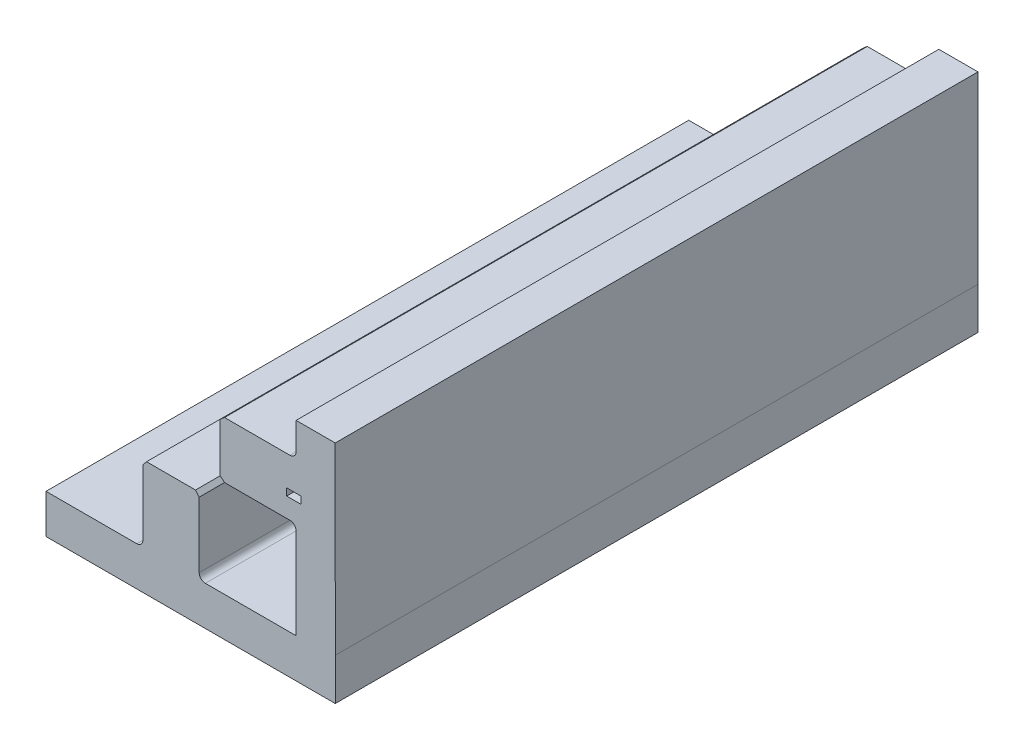
ISO-10303-21;
HEADER;
FILE_DESCRIPTION(('STEP AP214'),'2;1');
FILE_NAME('part.step','',(''),(''),'','','');
FILE_SCHEMA(('AUTOMOTIVE_DESIGN { 1 0 10303 214 1 1 1 1 }'));
ENDSEC;
DATA;
#1=APPLICATION_CONTEXT('core data for automotive mechanical design processes');
#2=APPLICATION_PROTOCOL_DEFINITION('international standard','automotive_design',2000,#1);
#3=PRODUCT_CONTEXT('',#1,'mechanical');
#4=PRODUCT('Part','Part','',(#3));
#5=PRODUCT_RELATED_PRODUCT_CATEGORY('part','',(#4));
#6=PRODUCT_DEFINITION_FORMATION('','',#4);
#7=PRODUCT_DEFINITION_CONTEXT('part definition',#1,'design');
#8=PRODUCT_DEFINITION('design','',#6,#7);
#9=PRODUCT_DEFINITION_SHAPE('','',#8);
#10=(LENGTH_UNIT() NAMED_UNIT(*) SI_UNIT(.MILLI.,.METRE.));
#11=(NAMED_UNIT(*) PLANE_ANGLE_UNIT() SI_UNIT($,.RADIAN.));
#12=(NAMED_UNIT(*) SI_UNIT($,.STERADIAN.) SOLID_ANGLE_UNIT());
#13=UNCERTAINTY_MEASURE_WITH_UNIT(LENGTH_MEASURE(1.E-05),#10,'distance_accuracy_value','');
#14=(GEOMETRIC_REPRESENTATION_CONTEXT(3) GLOBAL_UNCERTAINTY_ASSIGNED_CONTEXT((#13)) GLOBAL_UNIT_ASSIGNED_CONTEXT((#10,
#11,#12)) REPRESENTATION_CONTEXT('',''));
#15=CARTESIAN_POINT('',(0.,0.,0.));
#16=DIRECTION('',(0.,0.,1.));
#17=DIRECTION('',(1.,0.,0.));
#18=AXIS2_PLACEMENT_3D('',#15,#16,#17);
#19=CARTESIAN_POINT('',(17.7288391379452,22.9352063032006,-3749.675));
#20=DIRECTION('',(0.,-1.,0.));
#21=DIRECTION('',(0.,0.,-1.));
#22=AXIS2_PLACEMENT_3D('',#19,#20,#21);
#23=PLANE('',#22);
#24=DIRECTION('',(1.,0.,0.));
#25=VECTOR('',#24,1.);
#26=CARTESIAN_POINT('',(17.7288391379452,22.9352063032006,-3683.));
#27=LINE('',#26,#25);
#28=CARTESIAN_POINT('',(17.7288391379452,22.9352063032006,-3683.));
#29=VERTEX_POINT('',#28);
#30=CARTESIAN_POINT('',(21.7872141992322,22.9352063032006,-3683.));
#31=VERTEX_POINT('',#30);
#32=EDGE_CURVE('E265',#29,#31,#27,.T.);
#33=ORIENTED_EDGE('',*,*,#32,.T.);
#34=DIRECTION('',(0.,0.,1.));
#35=VECTOR('',#34,1.);
#36=CARTESIAN_POINT('',(21.7872141992322,22.9352063032006,-3749.675));
#37=LINE('',#36,#35);
#38=CARTESIAN_POINT('',(21.7872141992322,22.9352063032006,-3749.675));
#39=VERTEX_POINT('',#38);
#40=EDGE_CURVE('E11',#39,#31,#37,.T.);
#41=ORIENTED_EDGE('',*,*,#40,.F.);
#42=DIRECTION('',(1.,0.,0.));
#43=VECTOR('',#42,1.);
#44=CARTESIAN_POINT('',(17.7288391379452,22.9352063032006,-3749.675));
#45=LINE('',#44,#43);
#46=CARTESIAN_POINT('',(17.7288391379452,22.9352063032006,-3749.675));
#47=VERTEX_POINT('',#46);
#48=EDGE_CURVE('E268',#47,#39,#45,.T.);
#49=ORIENTED_EDGE('',*,*,#48,.F.);
#50=DIRECTION('',(0.,0.,1.));
#51=VECTOR('',#50,1.);
#52=CARTESIAN_POINT('',(17.7288391379452,22.9352063032006,-3749.675));
#53=LINE('',#52,#51);
#54=EDGE_CURVE('E320',#47,#29,#53,.T.);
#55=ORIENTED_EDGE('',*,*,#54,.T.);
#56=EDGE_LOOP('',(#33,#41,#49,#55));
#57=FACE_BOUND('',#56,.T.);
#58=ADVANCED_FACE('F33',(#57),#23,.F.);
#59=CARTESIAN_POINT('',(21.7872141992322,22.9352063032006,-3749.675));
#60=DIRECTION('',(-0.999999969550356,-0.000246777810830954,0.));
#61=DIRECTION('',(0.000246777810830954,-0.999999969550356,0.));
#62=AXIS2_PLACEMENT_3D('',#59,#60,#61);
#63=PLANE('',#62);
#64=DIRECTION('',(0.000246777810830954,-0.999999969550356,0.));
#65=VECTOR('',#64,1.);
#66=CARTESIAN_POINT('',(21.7872141992322,22.9352063032006,-3683.));
#67=LINE('',#66,#65);
#68=CARTESIAN_POINT('',(21.791921752024,3.85912878792336,-3683.));
#69=VERTEX_POINT('',#68);
#70=EDGE_CURVE('E323',#31,#69,#67,.T.);
#71=ORIENTED_EDGE('',*,*,#70,.T.);
#72=DIRECTION('',(0.,0.,1.));
#73=VECTOR('',#72,1.);
#74=CARTESIAN_POINT('',(21.791921752024,3.85912878792336,-3749.675));
#75=LINE('',#74,#73);
#76=CARTESIAN_POINT('',(21.791921752024,3.85912878792336,-3749.675));
#77=VERTEX_POINT('',#76);
#78=EDGE_CURVE('E40',#77,#69,#75,.T.);
#79=ORIENTED_EDGE('',*,*,#78,.F.);
#80=DIRECTION('',(0.000246777810830954,-0.999999969550356,0.));
#81=VECTOR('',#80,1.);
#82=CARTESIAN_POINT('',(21.7872141992322,22.9352063032006,-3749.675));
#83=LINE('',#82,#81);
#84=EDGE_CURVE('E271',#39,#77,#83,.T.);
#85=ORIENTED_EDGE('',*,*,#84,.F.);
#86=ORIENTED_EDGE('',*,*,#40,.T.);
#87=EDGE_LOOP('',(#71,#79,#85,#86));
#88=FACE_BOUND('',#87,.T.);
#89=ADVANCED_FACE('F432',(#88),#63,.F.);
#90=CARTESIAN_POINT('',(21.791921752024,-0.47513727151985,-3749.675));
#91=DIRECTION('',(-1.,0.,0.));
#92=DIRECTION('',(0.,0.,1.));
#93=AXIS2_PLACEMENT_3D('',#90,#91,#92);
#94=PLANE('',#93);
#95=DIRECTION('',(0.,-1.,0.));
#96=VECTOR('',#95,1.);
#97=CARTESIAN_POINT('',(21.791921752024,-0.47513727151985,-3683.));
#98=LINE('',#97,#96);
#99=CARTESIAN_POINT('',(21.791921752024,-0.47513727151985,-3683.));
#100=VERTEX_POINT('',#99);
#101=EDGE_CURVE('E326',#69,#100,#98,.T.);
#102=ORIENTED_EDGE('',*,*,#101,.T.);
#103=DIRECTION('',(0.,0.,1.));
#104=VECTOR('',#103,1.);
#105=CARTESIAN_POINT('',(21.791921752024,-0.47513727151985,-3749.675));
#106=LINE('',#105,#104);
#107=CARTESIAN_POINT('',(21.791921752024,-0.47513727151985,-3749.675));
#108=VERTEX_POINT('',#107);
#109=EDGE_CURVE('E423',#108,#100,#106,.T.);
#110=ORIENTED_EDGE('',*,*,#109,.F.);
#111=DIRECTION('',(0.,-1.,0.));
#112=VECTOR('',#111,1.);
#113=CARTESIAN_POINT('',(21.791921752024,3.58886272848015,-3749.675));
#114=LINE('',#113,#112);
#115=EDGE_CURVE('E274',#77,#108,#114,.T.);
#116=ORIENTED_EDGE('',*,*,#115,.F.);
#117=ORIENTED_EDGE('',*,*,#78,.T.);
#118=EDGE_LOOP('',(#102,#110,#116,#117));
#119=FACE_BOUND('',#118,.T.);
#120=ADVANCED_FACE('F429',(#119),#94,.F.);
#121=CARTESIAN_POINT('',(-8.21549203864979,-0.47513727151985,-3749.675));
#122=DIRECTION('',(0.,1.,0.));
#123=DIRECTION('',(-1.,0.,0.));
#124=AXIS2_PLACEMENT_3D('',#121,#122,#123);
#125=PLANE('',#124);
#126=DIRECTION('',(-1.,0.,0.));
#127=VECTOR('',#126,1.);
#128=CARTESIAN_POINT('',(-8.21549203864979,-0.47513727151985,-3683.));
#129=LINE('',#128,#127);
#130=CARTESIAN_POINT('',(-8.21549203864979,-0.47513727151985,-3683.));
#131=VERTEX_POINT('',#130);
#132=EDGE_CURVE('E329',#100,#131,#129,.T.);
#133=ORIENTED_EDGE('',*,*,#132,.T.);
#134=DIRECTION('',(0.,0.,1.));
#135=VECTOR('',#134,1.);
#136=CARTESIAN_POINT('',(-8.21549203864979,-0.47513727151985,-3749.675));
#137=LINE('',#136,#135);
#138=CARTESIAN_POINT('',(-8.21549203864979,-0.47513727151985,-3749.675));
#139=VERTEX_POINT('',#138);
#140=EDGE_CURVE('E420',#139,#131,#137,.T.);
#141=ORIENTED_EDGE('',*,*,#140,.F.);
#142=DIRECTION('',(-1.,0.,0.));
#143=VECTOR('',#142,1.);
#144=CARTESIAN_POINT('',(17.7279217520239,-0.47513727151985,-3749.675));
#145=LINE('',#144,#143);
#146=EDGE_CURVE('E276',#108,#139,#145,.T.);
#147=ORIENTED_EDGE('',*,*,#146,.F.);
#148=ORIENTED_EDGE('',*,*,#109,.T.);
#149=EDGE_LOOP('',(#133,#141,#147,#148));
#150=FACE_BOUND('',#149,.T.);
#151=ADVANCED_FACE('F440',(#150),#125,.F.);
#152=CARTESIAN_POINT('',(-8.21549203864979,3.58886272848015,-3749.675));
#153=DIRECTION('',(1.,0.,0.));
#154=DIRECTION('',(0.,0.,-1.));
#155=AXIS2_PLACEMENT_3D('',#152,#153,#154);
#156=PLANE('',#155);
#157=DIRECTION('',(0.,1.,0.));
#158=VECTOR('',#157,1.);
#159=CARTESIAN_POINT('',(-8.21549203864979,3.58886272848015,-3683.));
#160=LINE('',#159,#158);
#161=CARTESIAN_POINT('',(-8.21549203864979,3.58886272848015,-3683.));
#162=VERTEX_POINT('',#161);
#163=EDGE_CURVE('E331',#131,#162,#160,.T.);
#164=ORIENTED_EDGE('',*,*,#163,.T.);
#165=DIRECTION('',(0.,0.,1.));
#166=VECTOR('',#165,1.);
#167=CARTESIAN_POINT('',(-8.21549203864979,3.58886272848015,-3749.675));
#168=LINE('',#167,#166);
#169=CARTESIAN_POINT('',(-8.21549203864979,3.58886272848015,-3749.675));
#170=VERTEX_POINT('',#169);
#171=EDGE_CURVE('E417',#170,#162,#168,.T.);
#172=ORIENTED_EDGE('',*,*,#171,.F.);
#173=DIRECTION('',(0.,1.,0.));
#174=VECTOR('',#173,1.);
#175=CARTESIAN_POINT('',(-8.21549203864979,3.58886272848015,-3749.675));
#176=LINE('',#175,#174);
#177=EDGE_CURVE('E278',#139,#170,#176,.T.);
#178=ORIENTED_EDGE('',*,*,#177,.F.);
#179=ORIENTED_EDGE('',*,*,#140,.T.);
#180=EDGE_LOOP('',(#164,#172,#178,#179));
#181=FACE_BOUND('',#180,.T.);
#182=ADVANCED_FACE('F444',(#181),#156,.F.);
#183=CARTESIAN_POINT('',(-7.94526589326117,3.58886272848015,-3749.675));
#184=DIRECTION('',(0.,-1.,0.));
#185=DIRECTION('',(1.,0.,0.));
#186=AXIS2_PLACEMENT_3D('',#183,#184,#185);
#187=PLANE('',#186);
#188=DIRECTION('',(1.,0.,0.));
#189=VECTOR('',#188,1.);
#190=CARTESIAN_POINT('',(-7.94526589326117,3.58886272848015,-3683.));
#191=LINE('',#190,#189);
#192=CARTESIAN_POINT('',(1.19873410673898,3.58886272848015,-3683.));
#193=VERTEX_POINT('',#192);
#194=EDGE_CURVE('E334',#162,#193,#191,.T.);
#195=ORIENTED_EDGE('',*,*,#194,.T.);
#196=DIRECTION('',(0.,0.,1.));
#197=VECTOR('',#196,1.);
#198=CARTESIAN_POINT('',(1.19873410673898,3.58886272848015,-3749.675));
#199=LINE('',#198,#197);
#200=CARTESIAN_POINT('',(1.19873410673898,3.58886272848015,-3749.675));
#201=VERTEX_POINT('',#200);
#202=EDGE_CURVE('E414',#201,#193,#199,.T.);
#203=ORIENTED_EDGE('',*,*,#202,.F.);
#204=DIRECTION('',(1.,0.,0.));
#205=VECTOR('',#204,1.);
#206=CARTESIAN_POINT('',(-8.21549203864979,3.58886272848015,-3749.675));
#207=LINE('',#206,#205);
#208=EDGE_CURVE('E280',#170,#201,#207,.T.);
#209=ORIENTED_EDGE('',*,*,#208,.F.);
#210=ORIENTED_EDGE('',*,*,#171,.T.);
#211=EDGE_LOOP('',(#195,#203,#209,#210));
#212=FACE_BOUND('',#211,.T.);
#213=ADVANCED_FACE('F535',(#212),#187,.F.);
#214=CARTESIAN_POINT('',(1.19873410673898,4.22386272848,-3749.675));
#215=DIRECTION('',(0.,0.,1.));
#216=DIRECTION('',(1.,0.,0.));
#217=AXIS2_PLACEMENT_3D('',#214,#215,#216);
#218=CYLINDRICAL_SURFACE('',#217,0.634999999999852);
#219=CARTESIAN_POINT('',(1.19873410673898,4.22386272848,-3683.));
#220=DIRECTION('',(0.,0.,1.));
#221=DIRECTION('',(1.,0.,0.));
#222=AXIS2_PLACEMENT_3D('',#219,#220,#221);
#223=CIRCLE('',#222,0.634999999999852);
#224=CARTESIAN_POINT('',(1.83373410673883,4.22386272848,-3683.));
#225=VERTEX_POINT('',#224);
#226=EDGE_CURVE('E336',#193,#225,#223,.T.);
#227=ORIENTED_EDGE('',*,*,#226,.T.);
#228=DIRECTION('',(0.,0.,1.));
#229=VECTOR('',#228,1.);
#230=CARTESIAN_POINT('',(1.83373410673883,4.22386272848,-3749.675));
#231=LINE('',#230,#229);
#232=CARTESIAN_POINT('',(1.83373410673883,4.22386272848,-3749.675));
#233=VERTEX_POINT('',#232);
#234=EDGE_CURVE('E411',#233,#225,#231,.T.);
#235=ORIENTED_EDGE('',*,*,#234,.F.);
#236=CARTESIAN_POINT('',(1.19873410673898,4.22386272848,-3749.675));
#237=DIRECTION('',(0.,0.,1.));
#238=DIRECTION('',(1.,0.,0.));
#239=AXIS2_PLACEMENT_3D('',#236,#237,#238);
#240=CIRCLE('',#239,0.634999999999852);
#241=EDGE_CURVE('E282',#201,#233,#240,.T.);
#242=ORIENTED_EDGE('',*,*,#241,.F.);
#243=ORIENTED_EDGE('',*,*,#202,.T.);
#244=EDGE_LOOP('',(#227,#235,#242,#243));
#245=FACE_BOUND('',#244,.T.);
#246=ADVANCED_FACE('F533',(#245),#218,.F.);
#247=CARTESIAN_POINT('',(1.83373410673883,4.22386272848,-3749.675));
#248=DIRECTION('',(1.,0.,0.));
#249=DIRECTION('',(0.,0.,-1.));
#250=AXIS2_PLACEMENT_3D('',#247,#248,#249);
#251=PLANE('',#250);
#252=DIRECTION('',(0.,1.,0.));
#253=VECTOR('',#252,1.);
#254=CARTESIAN_POINT('',(1.83373410673883,4.22386272848,-3683.));
#255=LINE('',#254,#253);
#256=CARTESIAN_POINT('',(1.83373410673884,11.0088046097018,-3683.));
#257=VERTEX_POINT('',#256);
#258=EDGE_CURVE('E338',#225,#257,#255,.T.);
#259=ORIENTED_EDGE('',*,*,#258,.T.);
#260=DIRECTION('',(0.,0.,1.));
#261=VECTOR('',#260,1.);
#262=CARTESIAN_POINT('',(1.83373410673884,11.0088046097018,-3749.676));
#263=LINE('',#262,#261);
#264=CARTESIAN_POINT('',(1.83373410673884,11.0088046097018,-3749.675));
#265=VERTEX_POINT('',#264);
#266=EDGE_CURVE('E259',#265,#257,#263,.T.);
#267=ORIENTED_EDGE('',*,*,#266,.F.);
#268=DIRECTION('',(0.,1.,0.));
#269=VECTOR('',#268,1.);
#270=CARTESIAN_POINT('',(1.83373410673883,4.22386272848,-3749.675));
#271=LINE('',#270,#269);
#272=EDGE_CURVE('E284',#233,#265,#271,.T.);
#273=ORIENTED_EDGE('',*,*,#272,.F.);
#274=ORIENTED_EDGE('',*,*,#234,.T.);
#275=EDGE_LOOP('',(#259,#267,#273,#274));
#276=FACE_BOUND('',#275,.T.);
#277=ADVANCED_FACE('F528',(#276),#251,.F.);
#278=CARTESIAN_POINT('',(-1.62162944226117,6.89086268646194,-3749.675));
#279=DIRECTION('',(0.766044443118976,-0.642787609686542,0.));
#280=DIRECTION('',(0.642787609686542,0.766044443118976,0.));
#281=AXIS2_PLACEMENT_3D('',#278,#279,#280);
#282=PLANE('',#281);
#283=DIRECTION('',(0.642787609686542,0.766044443118976,0.));
#284=VECTOR('',#283,1.);
#285=CARTESIAN_POINT('',(-1.62162944226117,6.89086268646194,-3749.675));
#286=LINE('',#285,#284);
#287=CARTESIAN_POINT('',(2.21473410673884,11.4628627284801,-3749.675));
#288=VERTEX_POINT('',#287);
#289=EDGE_CURVE('E286',#265,#288,#286,.T.);
#290=ORIENTED_EDGE('',*,*,#289,.F.);
#291=ORIENTED_EDGE('',*,*,#266,.T.);
#292=DIRECTION('',(0.642787609686542,0.766044443118976,0.));
#293=VECTOR('',#292,1.);
#294=CARTESIAN_POINT('',(-1.62162944226117,6.89086268646194,-3683.));
#295=LINE('',#294,#293);
#296=CARTESIAN_POINT('',(2.21473410673884,11.4628627284801,-3683.));
#297=VERTEX_POINT('',#296);
#298=EDGE_CURVE('E340',#257,#297,#295,.T.);
#299=ORIENTED_EDGE('',*,*,#298,.T.);
#300=DIRECTION('',(0.,0.,1.));
#301=VECTOR('',#300,1.);
#302=CARTESIAN_POINT('',(2.21473410673884,11.4628627284801,-3749.675));
#303=LINE('',#302,#301);
#304=EDGE_CURVE('E408',#288,#297,#303,.T.);
#305=ORIENTED_EDGE('',*,*,#304,.F.);
#306=EDGE_LOOP('',(#290,#291,#299,#305));
#307=FACE_BOUND('',#306,.T.);
#308=ADVANCED_FACE('F523',(#307),#282,.F.);
#309=CARTESIAN_POINT('',(2.21473410673884,11.4628627284801,-3749.675));
#310=DIRECTION('',(0.,-1.,0.));
#311=DIRECTION('',(0.,0.,-1.));
#312=AXIS2_PLACEMENT_3D('',#309,#310,#311);
#313=PLANE('',#312);
#314=DIRECTION('',(1.,0.,0.));
#315=VECTOR('',#314,1.);
#316=CARTESIAN_POINT('',(2.21473410673884,11.4628627284801,-3683.));
#317=LINE('',#316,#315);
#318=CARTESIAN_POINT('',(7.29473410673884,11.4628627284801,-3683.));
#319=VERTEX_POINT('',#318);
#320=EDGE_CURVE('E342',#297,#319,#317,.T.);
#321=ORIENTED_EDGE('',*,*,#320,.T.);
#322=DIRECTION('',(0.,0.,1.));
#323=VECTOR('',#322,1.);
#324=CARTESIAN_POINT('',(7.29473410673884,11.4628627284801,-3749.675));
#325=LINE('',#324,#323);
#326=CARTESIAN_POINT('',(7.29473410673884,11.4628627284801,-3749.675));
#327=VERTEX_POINT('',#326);
#328=EDGE_CURVE('E405',#327,#319,#325,.T.);
#329=ORIENTED_EDGE('',*,*,#328,.F.);
#330=DIRECTION('',(1.,0.,0.));
#331=VECTOR('',#330,1.);
#332=CARTESIAN_POINT('',(2.21473410673884,11.4628627284801,-3749.675));
#333=LINE('',#332,#331);
#334=EDGE_CURVE('E288',#288,#327,#333,.T.);
#335=ORIENTED_EDGE('',*,*,#334,.F.);
#336=ORIENTED_EDGE('',*,*,#304,.T.);
#337=EDGE_LOOP('',(#321,#329,#335,#336));
#338=FACE_BOUND('',#337,.T.);
#339=ADVANCED_FACE('F519',(#338),#313,.F.);
#340=CARTESIAN_POINT('',(7.29473410673884,11.4628627284801,-3749.675));
#341=DIRECTION('',(-0.766044443118976,-0.642787609686542,0.));
#342=DIRECTION('',(0.642787609686542,-0.766044443118976,0.));
#343=AXIS2_PLACEMENT_3D('',#340,#341,#342);
#344=PLANE('',#343);
#345=DIRECTION('',(0.642787609686542,-0.766044443118976,0.));
#346=VECTOR('',#345,1.);
#347=CARTESIAN_POINT('',(7.29473410673884,11.4628627284801,-3683.));
#348=LINE('',#347,#346);
#349=CARTESIAN_POINT('',(7.67573410673884,11.0088046097018,-3683.));
#350=VERTEX_POINT('',#349);
#351=EDGE_CURVE('E344',#319,#350,#348,.T.);
#352=ORIENTED_EDGE('',*,*,#351,.T.);
#353=DIRECTION('',(0.,0.,1.));
#354=VECTOR('',#353,1.);
#355=CARTESIAN_POINT('',(7.67573410673884,11.0088046097018,-3749.676));
#356=LINE('',#355,#354);
#357=CARTESIAN_POINT('',(7.67573410673884,11.0088046097018,-3749.675));
#358=VERTEX_POINT('',#357);
#359=EDGE_CURVE('E262',#358,#350,#356,.T.);
#360=ORIENTED_EDGE('',*,*,#359,.F.);
#361=DIRECTION('',(0.642787609686542,-0.766044443118976,0.));
#362=VECTOR('',#361,1.);
#363=CARTESIAN_POINT('',(7.29473410673884,11.4628627284801,-3749.675));
#364=LINE('',#363,#362);
#365=EDGE_CURVE('E290',#327,#358,#364,.T.);
#366=ORIENTED_EDGE('',*,*,#365,.F.);
#367=ORIENTED_EDGE('',*,*,#328,.T.);
#368=EDGE_LOOP('',(#352,#360,#366,#367));
#369=FACE_BOUND('',#368,.T.);
#370=ADVANCED_FACE('F515',(#369),#344,.F.);
#371=CARTESIAN_POINT('',(7.67573410673884,5.7478627284803,-3749.675));
#372=DIRECTION('',(-1.,0.,0.));
#373=DIRECTION('',(0.,0.,1.));
#374=AXIS2_PLACEMENT_3D('',#371,#372,#373);
#375=PLANE('',#374);
#376=DIRECTION('',(0.,-1.,0.));
#377=VECTOR('',#376,1.);
#378=CARTESIAN_POINT('',(7.67573410673884,5.7478627284803,-3683.));
#379=LINE('',#378,#377);
#380=CARTESIAN_POINT('',(7.67573410673884,4.22386272848,-3683.));
#381=VERTEX_POINT('',#380);
#382=EDGE_CURVE('E347',#350,#381,#379,.T.);
#383=ORIENTED_EDGE('',*,*,#382,.T.);
#384=DIRECTION('',(0.,0.,1.));
#385=VECTOR('',#384,1.);
#386=CARTESIAN_POINT('',(7.67573410673884,4.22386272848,-3749.675));
#387=LINE('',#386,#385);
#388=CARTESIAN_POINT('',(7.67573410673884,4.22386272848,-3749.675));
#389=VERTEX_POINT('',#388);
#390=EDGE_CURVE('E402',#389,#381,#387,.T.);
#391=ORIENTED_EDGE('',*,*,#390,.F.);
#392=DIRECTION('',(0.,-1.,0.));
#393=VECTOR('',#392,1.);
#394=CARTESIAN_POINT('',(7.67573410673884,5.7478627284803,-3749.675));
#395=LINE('',#394,#393);
#396=EDGE_CURVE('E293',#358,#389,#395,.T.);
#397=ORIENTED_EDGE('',*,*,#396,.F.);
#398=ORIENTED_EDGE('',*,*,#359,.T.);
#399=EDGE_LOOP('',(#383,#391,#397,#398));
#400=FACE_BOUND('',#399,.T.);
#401=ADVANCED_FACE('F510',(#400),#375,.F.);
#402=CARTESIAN_POINT('',(8.31073410673869,4.22386272848,-3749.675));
#403=DIRECTION('',(0.,0.,1.));
#404=DIRECTION('',(1.,0.,0.));
#405=AXIS2_PLACEMENT_3D('',#402,#403,#404);
#406=CYLINDRICAL_SURFACE('',#405,0.634999999999847);
#407=CARTESIAN_POINT('',(8.31073410673869,4.22386272848,-3683.));
#408=DIRECTION('',(0.,0.,1.));
#409=DIRECTION('',(1.,0.,0.));
#410=AXIS2_PLACEMENT_3D('',#407,#408,#409);
#411=CIRCLE('',#410,0.634999999999847);
#412=CARTESIAN_POINT('',(8.31073410673869,3.58886272848015,-3683.));
#413=VERTEX_POINT('',#412);
#414=EDGE_CURVE('E349',#381,#413,#411,.T.);
#415=ORIENTED_EDGE('',*,*,#414,.T.);
#416=DIRECTION('',(0.,0.,1.));
#417=VECTOR('',#416,1.);
#418=CARTESIAN_POINT('',(8.31073410673869,3.58886272848015,-3749.675));
#419=LINE('',#418,#417);
#420=CARTESIAN_POINT('',(8.31073410673869,3.58886272848015,-3749.675));
#421=VERTEX_POINT('',#420);
#422=EDGE_CURVE('E399',#421,#413,#419,.T.);
#423=ORIENTED_EDGE('',*,*,#422,.F.);
#424=CARTESIAN_POINT('',(8.31073410673869,4.22386272848,-3749.675));
#425=DIRECTION('',(0.,0.,1.));
#426=DIRECTION('',(1.,0.,0.));
#427=AXIS2_PLACEMENT_3D('',#424,#425,#426);
#428=CIRCLE('',#427,0.634999999999847);
#429=EDGE_CURVE('E295',#389,#421,#428,.T.);
#430=ORIENTED_EDGE('',*,*,#429,.F.);
#431=ORIENTED_EDGE('',*,*,#390,.T.);
#432=EDGE_LOOP('',(#415,#423,#430,#431));
#433=FACE_BOUND('',#432,.T.);
#434=ADVANCED_FACE('F502',(#433),#406,.F.);
#435=CARTESIAN_POINT('',(17.4547341067388,3.58886272848015,-3749.675));
#436=DIRECTION('',(0.,-1.,0.));
#437=DIRECTION('',(1.,0.,0.));
#438=AXIS2_PLACEMENT_3D('',#435,#436,#437);
#439=PLANE('',#438);
#440=DIRECTION('',(1.,0.,0.));
#441=VECTOR('',#440,1.);
#442=CARTESIAN_POINT('',(17.4547341067388,3.58886272848015,-3683.));
#443=LINE('',#442,#441);
#444=CARTESIAN_POINT('',(17.7279217520239,3.58886272848015,-3683.));
#445=VERTEX_POINT('',#444);
#446=EDGE_CURVE('E352',#413,#445,#443,.T.);
#447=ORIENTED_EDGE('',*,*,#446,.T.);
#448=DIRECTION('',(0.,0.,1.));
#449=VECTOR('',#448,1.);
#450=CARTESIAN_POINT('',(17.7279217520239,3.58886272848015,-3749.675));
#451=LINE('',#450,#449);
#452=CARTESIAN_POINT('',(17.7279217520239,3.58886272848015,-3749.675));
#453=VERTEX_POINT('',#452);
#454=EDGE_CURVE('E396',#453,#445,#451,.T.);
#455=ORIENTED_EDGE('',*,*,#454,.F.);
#456=DIRECTION('',(1.,0.,0.));
#457=VECTOR('',#456,1.);
#458=CARTESIAN_POINT('',(8.31073410673869,3.58886272848015,-3749.675));
#459=LINE('',#458,#457);
#460=EDGE_CURVE('E297',#421,#453,#459,.T.);
#461=ORIENTED_EDGE('',*,*,#460,.F.);
#462=ORIENTED_EDGE('',*,*,#422,.T.);
#463=EDGE_LOOP('',(#447,#455,#461,#462));
#464=FACE_BOUND('',#463,.T.);
#465=ADVANCED_FACE('F506',(#464),#439,.F.);
#466=CARTESIAN_POINT('',(17.7279217520239,3.58886272848015,-3749.675));
#467=DIRECTION('',(1.,0.,0.));
#468=DIRECTION('',(0.,0.,-1.));
#469=AXIS2_PLACEMENT_3D('',#466,#467,#468);
#470=PLANE('',#469);
#471=DIRECTION('',(0.,1.,0.));
#472=VECTOR('',#471,1.);
#473=CARTESIAN_POINT('',(17.7279217520239,3.58886272848015,-3683.));
#474=LINE('',#473,#472);
#475=CARTESIAN_POINT('',(17.7279217520239,3.85884275420049,-3683.));
#476=VERTEX_POINT('',#475);
#477=EDGE_CURVE('E354',#445,#476,#474,.T.);
#478=ORIENTED_EDGE('',*,*,#477,.T.);
#479=DIRECTION('',(0.,0.,1.));
#480=VECTOR('',#479,1.);
#481=CARTESIAN_POINT('',(17.7279217520239,3.85884275420049,-3749.675));
#482=LINE('',#481,#480);
#483=CARTESIAN_POINT('',(17.7279217520239,3.85884275420049,-3749.675));
#484=VERTEX_POINT('',#483);
#485=EDGE_CURVE('E393',#484,#476,#482,.T.);
#486=ORIENTED_EDGE('',*,*,#485,.F.);
#487=DIRECTION('',(0.,1.,0.));
#488=VECTOR('',#487,1.);
#489=CARTESIAN_POINT('',(17.7279217520239,3.58886272848015,-3749.675));
#490=LINE('',#489,#488);
#491=EDGE_CURVE('E299',#453,#484,#490,.T.);
#492=ORIENTED_EDGE('',*,*,#491,.F.);
#493=ORIENTED_EDGE('',*,*,#454,.T.);
#494=EDGE_LOOP('',(#478,#486,#492,#493));
#495=FACE_BOUND('',#494,.T.);
#496=ADVANCED_FACE('F496',(#495),#470,.F.);
#497=CARTESIAN_POINT('',(17.7279217520239,3.85884275420049,-3749.675));
#498=DIRECTION('',(0.999999998843667,-4.80901885618899E-05,0.));
#499=DIRECTION('',(4.80901885618899E-05,0.999999998843667,0.));
#500=AXIS2_PLACEMENT_3D('',#497,#498,#499);
#501=PLANE('',#500);
#502=DIRECTION('',(4.80901885618899E-05,0.999999998843667,0.));
#503=VECTOR('',#502,1.);
#504=CARTESIAN_POINT('',(17.7279217520239,3.85884275420049,-3683.));
#505=LINE('',#504,#503);
#506=CARTESIAN_POINT('',(17.7283614660931,13.002372480981,-3683.));
#507=VERTEX_POINT('',#506);
#508=EDGE_CURVE('E356',#476,#507,#505,.T.);
#509=ORIENTED_EDGE('',*,*,#508,.T.);
#510=DIRECTION('',(0.,0.,1.));
#511=VECTOR('',#510,1.);
#512=CARTESIAN_POINT('',(17.7283614660931,13.002372480981,-3749.675));
#513=LINE('',#512,#511);
#514=CARTESIAN_POINT('',(17.7283614660931,13.002372480981,-3749.675));
#515=VERTEX_POINT('',#514);
#516=EDGE_CURVE('E390',#515,#507,#513,.T.);
#517=ORIENTED_EDGE('',*,*,#516,.F.);
#518=DIRECTION('',(4.80901885618899E-05,0.999999998843667,0.));
#519=VECTOR('',#518,1.);
#520=CARTESIAN_POINT('',(17.7279217520239,3.85884275420049,-3749.675));
#521=LINE('',#520,#519);
#522=EDGE_CURVE('E301',#484,#515,#521,.T.);
#523=ORIENTED_EDGE('',*,*,#522,.F.);
#524=ORIENTED_EDGE('',*,*,#485,.T.);
#525=EDGE_LOOP('',(#509,#517,#523,#524));
#526=FACE_BOUND('',#525,.T.);
#527=ADVANCED_FACE('F492',(#526),#501,.F.);
#528=CARTESIAN_POINT('',(17.0929217520241,13.0024030393967,-3749.675));
#529=DIRECTION('',(0.,0.,1.));
#530=DIRECTION('',(1.,0.,0.));
#531=AXIS2_PLACEMENT_3D('',#528,#529,#530);
#532=CYLINDRICAL_SURFACE('',#531,0.635439714803768);
#533=CARTESIAN_POINT('',(17.0929217520241,13.0024030393967,-3683.));
#534=DIRECTION('',(0.,0.,1.));
#535=DIRECTION('',(1.,0.,0.));
#536=AXIS2_PLACEMENT_3D('',#533,#534,#535);
#537=CIRCLE('',#536,0.635439714803768);
#538=CARTESIAN_POINT('',(17.0929217520241,13.6378427542005,-3683.));
#539=VERTEX_POINT('',#538);
#540=EDGE_CURVE('E358',#507,#539,#537,.T.);
#541=ORIENTED_EDGE('',*,*,#540,.T.);
#542=DIRECTION('',(0.,0.,1.));
#543=VECTOR('',#542,1.);
#544=CARTESIAN_POINT('',(17.0929217520241,13.6378427542005,-3749.675));
#545=LINE('',#544,#543);
#546=CARTESIAN_POINT('',(17.0929217520241,13.6378427542005,-3749.675));
#547=VERTEX_POINT('',#546);
#548=EDGE_CURVE('E387',#547,#539,#545,.T.);
#549=ORIENTED_EDGE('',*,*,#548,.F.);
#550=CARTESIAN_POINT('',(17.0929217520241,13.0024030393967,-3749.675));
#551=DIRECTION('',(0.,0.,1.));
#552=DIRECTION('',(1.,0.,0.));
#553=AXIS2_PLACEMENT_3D('',#550,#551,#552);
#554=CIRCLE('',#553,0.635439714803768);
#555=EDGE_CURVE('E303',#515,#547,#554,.T.);
#556=ORIENTED_EDGE('',*,*,#555,.F.);
#557=ORIENTED_EDGE('',*,*,#516,.T.);
#558=EDGE_LOOP('',(#541,#549,#556,#557));
#559=FACE_BOUND('',#558,.T.);
#560=ADVANCED_FACE('F487',(#559),#532,.F.);
#561=CARTESIAN_POINT('',(17.0929217520241,13.6378427542005,-3749.675));
#562=DIRECTION('',(0.,1.,0.));
#563=DIRECTION('',(-1.,0.,0.));
#564=AXIS2_PLACEMENT_3D('',#561,#562,#563);
#565=PLANE('',#564);
#566=DIRECTION('',(-1.,0.,0.));
#567=VECTOR('',#566,1.);
#568=CARTESIAN_POINT('',(17.0929217520241,13.6378427542005,-3683.));
#569=LINE('',#568,#567);
#570=CARTESIAN_POINT('',(10.3079798708025,13.6378427542006,-3683.));
#571=VERTEX_POINT('',#570);
#572=EDGE_CURVE('E360',#539,#571,#569,.T.);
#573=ORIENTED_EDGE('',*,*,#572,.T.);
#574=DIRECTION('',(0.,0.,1.));
#575=VECTOR('',#574,1.);
#576=CARTESIAN_POINT('',(10.3079798708025,13.6378427542006,-3749.676));
#577=LINE('',#576,#575);
#578=CARTESIAN_POINT('',(10.3079798708025,13.6378427542006,-3749.675));
#579=VERTEX_POINT('',#578);
#580=EDGE_CURVE('E253',#579,#571,#577,.T.);
#581=ORIENTED_EDGE('',*,*,#580,.F.);
#582=DIRECTION('',(-1.,0.,0.));
#583=VECTOR('',#582,1.);
#584=CARTESIAN_POINT('',(17.0929217520241,13.6378427542005,-3749.675));
#585=LINE('',#584,#583);
#586=EDGE_CURVE('E305',#547,#579,#585,.T.);
#587=ORIENTED_EDGE('',*,*,#586,.F.);
#588=ORIENTED_EDGE('',*,*,#548,.T.);
#589=EDGE_LOOP('',(#573,#581,#587,#588));
#590=FACE_BOUND('',#589,.T.);
#591=ADVANCED_FACE('F481',(#590),#565,.F.);
#592=CARTESIAN_POINT('',(14.4259217940422,10.1824792052005,-3749.675));
#593=DIRECTION('',(0.642787609686549,0.76604444311897,0.));
#594=DIRECTION('',(-0.76604444311897,0.642787609686549,0.));
#595=AXIS2_PLACEMENT_3D('',#592,#593,#594);
#596=PLANE('',#595);
#597=DIRECTION('',(-0.76604444311897,0.642787609686549,0.));
#598=VECTOR('',#597,1.);
#599=CARTESIAN_POINT('',(14.4259217940422,10.1824792052005,-3749.675));
#600=LINE('',#599,#598);
#601=CARTESIAN_POINT('',(9.85392175202405,14.0188427542006,-3749.675));
#602=VERTEX_POINT('',#601);
#603=EDGE_CURVE('E307',#579,#602,#600,.T.);
#604=ORIENTED_EDGE('',*,*,#603,.F.);
#605=ORIENTED_EDGE('',*,*,#580,.T.);
#606=DIRECTION('',(-0.76604444311897,0.642787609686549,0.));
#607=VECTOR('',#606,1.);
#608=CARTESIAN_POINT('',(14.4259217940422,10.1824792052005,-3683.));
#609=LINE('',#608,#607);
#610=CARTESIAN_POINT('',(9.85392175202405,14.0188427542006,-3683.));
#611=VERTEX_POINT('',#610);
#612=EDGE_CURVE('E362',#571,#611,#609,.T.);
#613=ORIENTED_EDGE('',*,*,#612,.T.);
#614=DIRECTION('',(0.,0.,1.));
#615=VECTOR('',#614,1.);
#616=CARTESIAN_POINT('',(9.85392175202405,14.0188427542006,-3749.675));
#617=LINE('',#616,#615);
#618=EDGE_CURVE('E384',#602,#611,#617,.T.);
#619=ORIENTED_EDGE('',*,*,#618,.F.);
#620=EDGE_LOOP('',(#604,#605,#613,#619));
#621=FACE_BOUND('',#620,.T.);
#622=ADVANCED_FACE('F477',(#621),#596,.F.);
#623=CARTESIAN_POINT('',(9.85392175202405,14.0188427542006,-3749.675));
#624=DIRECTION('',(1.,0.,0.));
#625=DIRECTION('',(0.,0.,-1.));
#626=AXIS2_PLACEMENT_3D('',#623,#624,#625);
#627=PLANE('',#626);
#628=DIRECTION('',(0.,1.,0.));
#629=VECTOR('',#628,1.);
#630=CARTESIAN_POINT('',(9.85392175202405,14.0188427542006,-3683.));
#631=LINE('',#630,#629);
#632=CARTESIAN_POINT('',(9.85392175202405,19.0988427542006,-3683.));
#633=VERTEX_POINT('',#632);
#634=EDGE_CURVE('E364',#611,#633,#631,.T.);
#635=ORIENTED_EDGE('',*,*,#634,.T.);
#636=DIRECTION('',(0.,0.,1.));
#637=VECTOR('',#636,1.);
#638=CARTESIAN_POINT('',(9.85392175202405,19.0988427542006,-3749.675));
#639=LINE('',#638,#637);
#640=CARTESIAN_POINT('',(9.85392175202405,19.0988427542006,-3749.675));
#641=VERTEX_POINT('',#640);
#642=EDGE_CURVE('E381',#641,#633,#639,.T.);
#643=ORIENTED_EDGE('',*,*,#642,.F.);
#644=DIRECTION('',(0.,1.,0.));
#645=VECTOR('',#644,1.);
#646=CARTESIAN_POINT('',(9.85392175202405,14.0188427542006,-3749.675));
#647=LINE('',#646,#645);
#648=EDGE_CURVE('E309',#602,#641,#647,.T.);
#649=ORIENTED_EDGE('',*,*,#648,.F.);
#650=ORIENTED_EDGE('',*,*,#618,.T.);
#651=EDGE_LOOP('',(#635,#643,#649,#650));
#652=FACE_BOUND('',#651,.T.);
#653=ADVANCED_FACE('F472',(#652),#627,.F.);
#654=CARTESIAN_POINT('',(9.85392175202405,19.0988427542006,-3749.675));
#655=DIRECTION('',(0.642787609686534,-0.766044443118982,0.));
#656=DIRECTION('',(0.766044443118983,0.642787609686534,0.));
#657=AXIS2_PLACEMENT_3D('',#654,#655,#656);
#658=PLANE('',#657);
#659=DIRECTION('',(0.766044443118983,0.642787609686534,0.));
#660=VECTOR('',#659,1.);
#661=CARTESIAN_POINT('',(9.85392175202405,19.0988427542006,-3683.));
#662=LINE('',#661,#660);
#663=CARTESIAN_POINT('',(10.3079798708025,19.4798427542007,-3683.));
#664=VERTEX_POINT('',#663);
#665=EDGE_CURVE('E366',#633,#664,#662,.T.);
#666=ORIENTED_EDGE('',*,*,#665,.T.);
#667=DIRECTION('',(0.,0.,1.));
#668=VECTOR('',#667,1.);
#669=CARTESIAN_POINT('',(10.3079798708025,19.4798427542007,-3749.676));
#670=LINE('',#669,#668);
#671=CARTESIAN_POINT('',(10.3079798708025,19.4798427542007,-3749.675));
#672=VERTEX_POINT('',#671);
#673=EDGE_CURVE('E257',#672,#664,#670,.T.);
#674=ORIENTED_EDGE('',*,*,#673,.F.);
#675=DIRECTION('',(0.766044443118983,0.642787609686534,0.));
#676=VECTOR('',#675,1.);
#677=CARTESIAN_POINT('',(9.85392175202405,19.0988427542006,-3749.675));
#678=LINE('',#677,#676);
#679=EDGE_CURVE('E311',#641,#672,#678,.T.);
#680=ORIENTED_EDGE('',*,*,#679,.F.);
#681=ORIENTED_EDGE('',*,*,#642,.T.);
#682=EDGE_LOOP('',(#666,#674,#680,#681));
#683=FACE_BOUND('',#682,.T.);
#684=ADVANCED_FACE('F466',(#683),#658,.F.);
#685=CARTESIAN_POINT('',(15.568921752024,19.4798427542007,-3749.675));
#686=DIRECTION('',(0.,-1.,0.));
#687=DIRECTION('',(0.,0.,-1.));
#688=AXIS2_PLACEMENT_3D('',#685,#686,#687);
#689=PLANE('',#688);
#690=DIRECTION('',(1.,0.,0.));
#691=VECTOR('',#690,1.);
#692=CARTESIAN_POINT('',(15.568921752024,19.4798427542007,-3683.));
#693=LINE('',#692,#691);
#694=CARTESIAN_POINT('',(17.0929217520242,19.4798427542007,-3683.));
#695=VERTEX_POINT('',#694);
#696=EDGE_CURVE('E55',#664,#695,#693,.T.);
#697=ORIENTED_EDGE('',*,*,#696,.T.);
#698=DIRECTION('',(0.,0.,1.));
#699=VECTOR('',#698,1.);
#700=CARTESIAN_POINT('',(17.0929217520242,19.4798427542007,-3749.675));
#701=LINE('',#700,#699);
#702=CARTESIAN_POINT('',(17.0929217520242,19.4798427542007,-3749.675));
#703=VERTEX_POINT('',#702);
#704=EDGE_CURVE('E378',#703,#695,#701,.T.);
#705=ORIENTED_EDGE('',*,*,#704,.F.);
#706=DIRECTION('',(1.,0.,0.));
#707=VECTOR('',#706,1.);
#708=CARTESIAN_POINT('',(15.568921752024,19.4798427542007,-3749.675));
#709=LINE('',#708,#707);
#710=EDGE_CURVE('E314',#672,#703,#709,.T.);
#711=ORIENTED_EDGE('',*,*,#710,.F.);
#712=ORIENTED_EDGE('',*,*,#673,.T.);
#713=EDGE_LOOP('',(#697,#705,#711,#712));
#714=FACE_BOUND('',#713,.T.);
#715=ADVANCED_FACE('F462',(#714),#689,.F.);
#716=CARTESIAN_POINT('',(17.0929217520242,20.1156245451678,-3749.675));
#717=DIRECTION('',(0.,0.,1.));
#718=DIRECTION('',(1.,0.,0.));
#719=AXIS2_PLACEMENT_3D('',#716,#717,#718);
#720=CYLINDRICAL_SURFACE('',#719,0.635781790967193);
#721=CARTESIAN_POINT('',(17.0929217520242,20.1156245451678,-3683.));
#722=DIRECTION('',(0.,0.,1.));
#723=DIRECTION('',(1.,0.,0.));
#724=AXIS2_PLACEMENT_3D('',#721,#722,#723);
#725=CIRCLE('',#724,0.635781790967193);
#726=CARTESIAN_POINT('',(17.7287035422562,20.1155939703016,-3683.));
#727=VERTEX_POINT('',#726);
#728=EDGE_CURVE('E370',#695,#727,#725,.T.);
#729=ORIENTED_EDGE('',*,*,#728,.T.);
#730=DIRECTION('',(0.,0.,1.));
#731=VECTOR('',#730,1.);
#732=CARTESIAN_POINT('',(17.7287035422562,20.1155939703016,-3749.675));
#733=LINE('',#732,#731);
#734=CARTESIAN_POINT('',(17.7287035422562,20.1155939703016,-3749.675));
#735=VERTEX_POINT('',#734);
#736=EDGE_CURVE('E375',#735,#727,#733,.T.);
#737=ORIENTED_EDGE('',*,*,#736,.F.);
#738=CARTESIAN_POINT('',(17.0929217520242,20.1156245451678,-3749.675));
#739=DIRECTION('',(0.,0.,1.));
#740=DIRECTION('',(1.,0.,0.));
#741=AXIS2_PLACEMENT_3D('',#738,#739,#740);
#742=CIRCLE('',#741,0.635781790967193);
#743=EDGE_CURVE('E316',#703,#735,#742,.T.);
#744=ORIENTED_EDGE('',*,*,#743,.F.);
#745=ORIENTED_EDGE('',*,*,#704,.T.);
#746=EDGE_LOOP('',(#729,#737,#744,#745));
#747=FACE_BOUND('',#746,.T.);
#748=ADVANCED_FACE('F458',(#747),#720,.F.);
#749=CARTESIAN_POINT('',(17.7287035422562,20.1155939703016,-3749.675));
#750=DIRECTION('',(0.999999998843667,-4.80901885604205E-05,0.));
#751=DIRECTION('',(4.80901885604206E-05,0.999999998843667,0.));
#752=AXIS2_PLACEMENT_3D('',#749,#750,#751);
#753=PLANE('',#752);
#754=DIRECTION('',(4.80901885604206E-05,0.999999998843667,0.));
#755=VECTOR('',#754,1.);
#756=CARTESIAN_POINT('',(17.7287035422562,20.1155939703016,-3683.));
#757=LINE('',#756,#755);
#758=EDGE_CURVE('E272',#727,#29,#757,.T.);
#759=ORIENTED_EDGE('',*,*,#758,.T.);
#760=ORIENTED_EDGE('',*,*,#54,.F.);
#761=DIRECTION('',(4.80901885604206E-05,0.999999998843667,0.));
#762=VECTOR('',#761,1.);
#763=CARTESIAN_POINT('',(17.7287035422562,20.1155939703016,-3749.675));
#764=LINE('',#763,#762);
#765=EDGE_CURVE('E318',#735,#47,#764,.T.);
#766=ORIENTED_EDGE('',*,*,#765,.F.);
#767=ORIENTED_EDGE('',*,*,#736,.T.);
#768=EDGE_LOOP('',(#759,#760,#766,#767));
#769=FACE_BOUND('',#768,.T.);
#770=ADVANCED_FACE('F455',(#769),#753,.F.);
#771=CARTESIAN_POINT('',(1.19873410673898,4.22386272848,-3749.675));
#772=DIRECTION('',(0.,0.,1.));
#773=DIRECTION('',(1.,0.,0.));
#774=AXIS2_PLACEMENT_3D('',#771,#772,#773);
#775=PLANE('',#774);
#776=ORIENTED_EDGE('',*,*,#679,.T.);
#777=ORIENTED_EDGE('',*,*,#710,.T.);
#778=ORIENTED_EDGE('',*,*,#743,.T.);
#779=ORIENTED_EDGE('',*,*,#765,.T.);
#780=ORIENTED_EDGE('',*,*,#48,.T.);
#781=ORIENTED_EDGE('',*,*,#84,.T.);
#782=ORIENTED_EDGE('',*,*,#115,.T.);
#783=ORIENTED_EDGE('',*,*,#146,.T.);
#784=ORIENTED_EDGE('',*,*,#177,.T.);
#785=ORIENTED_EDGE('',*,*,#208,.T.);
#786=ORIENTED_EDGE('',*,*,#241,.T.);
#787=ORIENTED_EDGE('',*,*,#272,.T.);
#788=ORIENTED_EDGE('',*,*,#289,.T.);
#789=ORIENTED_EDGE('',*,*,#334,.T.);
#790=ORIENTED_EDGE('',*,*,#365,.T.);
#791=ORIENTED_EDGE('',*,*,#396,.T.);
#792=ORIENTED_EDGE('',*,*,#429,.T.);
#793=ORIENTED_EDGE('',*,*,#460,.T.);
#794=ORIENTED_EDGE('',*,*,#491,.T.);
#795=ORIENTED_EDGE('',*,*,#522,.T.);
#796=ORIENTED_EDGE('',*,*,#555,.T.);
#797=ORIENTED_EDGE('',*,*,#586,.T.);
#798=ORIENTED_EDGE('',*,*,#603,.T.);
#799=ORIENTED_EDGE('',*,*,#648,.T.);
#800=EDGE_LOOP('',(#776,#777,#778,#779,#780,#781,#782,#783,#784,#785,#786,#787,#788,#789,#790,
#791,#792,#793,#794,#795,#796,#797,#798,#799));
#801=FACE_BOUND('',#800,.T.);
#802=ADVANCED_FACE('F448',(#801),#775,.F.);
#803=CARTESIAN_POINT('',(1.19873410673898,4.22386272848,-3683.));
#804=DIRECTION('',(0.,0.,1.));
#805=DIRECTION('',(1.,0.,0.));
#806=AXIS2_PLACEMENT_3D('',#803,#804,#805);
#807=PLANE('',#806);
#808=DIRECTION('',(0.,-1.,0.));
#809=VECTOR('',#808,1.);
#810=CARTESIAN_POINT('',(16.751967486428,16.3860262822482,-3683.));
#811=LINE('',#810,#809);
#812=CARTESIAN_POINT('',(16.751967486428,16.3860262822482,-3683.));
#813=VERTEX_POINT('',#812);
#814=CARTESIAN_POINT('',(16.751967486428,15.6465565962094,-3683.));
#815=VERTEX_POINT('',#814);
#816=EDGE_CURVE('E47',#813,#815,#811,.T.);
#817=ORIENTED_EDGE('',*,*,#816,.F.);
#818=DIRECTION('',(-1.,0.,0.));
#819=VECTOR('',#818,1.);
#820=CARTESIAN_POINT('',(16.751967486428,16.3860262822482,-3683.));
#821=LINE('',#820,#819);
#822=CARTESIAN_POINT('',(18.241278110068,16.3860262822482,-3683.));
#823=VERTEX_POINT('',#822);
#824=EDGE_CURVE('E238',#823,#813,#821,.T.);
#825=ORIENTED_EDGE('',*,*,#824,.F.);
#826=DIRECTION('',(0.,1.,0.));
#827=VECTOR('',#826,1.);
#828=CARTESIAN_POINT('',(18.241278110068,16.3860262822482,-3683.));
#829=LINE('',#828,#827);
#830=CARTESIAN_POINT('',(18.241278110068,15.6465565962094,-3683.));
#831=VERTEX_POINT('',#830);
#832=EDGE_CURVE('E241',#831,#823,#829,.T.);
#833=ORIENTED_EDGE('',*,*,#832,.F.);
#834=DIRECTION('',(1.,0.,0.));
#835=VECTOR('',#834,1.);
#836=CARTESIAN_POINT('',(16.751967486428,15.6465565962094,-3683.));
#837=LINE('',#836,#835);
#838=EDGE_CURVE('E247',#815,#831,#837,.T.);
#839=ORIENTED_EDGE('',*,*,#838,.F.);
#840=EDGE_LOOP('',(#817,#825,#833,#839));
#841=FACE_BOUND('',#840,.T.);
#842=ORIENTED_EDGE('',*,*,#696,.F.);
#843=ORIENTED_EDGE('',*,*,#665,.F.);
#844=ORIENTED_EDGE('',*,*,#634,.F.);
#845=ORIENTED_EDGE('',*,*,#612,.F.);
#846=ORIENTED_EDGE('',*,*,#572,.F.);
#847=ORIENTED_EDGE('',*,*,#540,.F.);
#848=ORIENTED_EDGE('',*,*,#508,.F.);
#849=ORIENTED_EDGE('',*,*,#477,.F.);
#850=ORIENTED_EDGE('',*,*,#446,.F.);
#851=ORIENTED_EDGE('',*,*,#414,.F.);
#852=ORIENTED_EDGE('',*,*,#382,.F.);
#853=ORIENTED_EDGE('',*,*,#351,.F.);
#854=ORIENTED_EDGE('',*,*,#320,.F.);
#855=ORIENTED_EDGE('',*,*,#298,.F.);
#856=ORIENTED_EDGE('',*,*,#258,.F.);
#857=ORIENTED_EDGE('',*,*,#226,.F.);
#858=ORIENTED_EDGE('',*,*,#194,.F.);
#859=ORIENTED_EDGE('',*,*,#163,.F.);
#860=ORIENTED_EDGE('',*,*,#132,.F.);
#861=ORIENTED_EDGE('',*,*,#101,.F.);
#862=ORIENTED_EDGE('',*,*,#70,.F.);
#863=ORIENTED_EDGE('',*,*,#32,.F.);
#864=ORIENTED_EDGE('',*,*,#758,.F.);
#865=ORIENTED_EDGE('',*,*,#728,.F.);
#866=EDGE_LOOP('',(#842,#843,#844,#845,#846,#847,#848,#849,#850,#851,#852,#853,#854,#855,#856,
#857,#858,#859,#860,#861,#862,#863,#864,#865));
#867=FACE_BOUND('',#866,.T.);
#868=ADVANCED_FACE('F435',(#841,#867),#807,.T.);
#869=CARTESIAN_POINT('',(16.751967486428,16.3860262822482,-3685.54));
#870=DIRECTION('',(-1.,0.,0.));
#871=DIRECTION('',(0.,0.,1.));
#872=AXIS2_PLACEMENT_3D('',#869,#870,#871);
#873=PLANE('',#872);
#874=ORIENTED_EDGE('',*,*,#816,.T.);
#875=DIRECTION('',(0.,0.,1.));
#876=VECTOR('',#875,1.);
#877=CARTESIAN_POINT('',(16.751967486428,15.6465565962094,-3685.54));
#878=LINE('',#877,#876);
#879=CARTESIAN_POINT('',(16.751967486428,15.6465565962094,-3685.54));
#880=VERTEX_POINT('',#879);
#881=EDGE_CURVE('E216',#880,#815,#878,.T.);
#882=ORIENTED_EDGE('',*,*,#881,.F.);
#883=DIRECTION('',(0.,-1.,0.));
#884=VECTOR('',#883,1.);
#885=CARTESIAN_POINT('',(16.751967486428,16.3860262822482,-3685.54));
#886=LINE('',#885,#884);
#887=CARTESIAN_POINT('',(16.751967486428,16.3860262822482,-3685.54));
#888=VERTEX_POINT('',#887);
#889=EDGE_CURVE('E220',#888,#880,#886,.T.);
#890=ORIENTED_EDGE('',*,*,#889,.F.);
#891=DIRECTION('',(0.,0.,1.));
#892=VECTOR('',#891,1.);
#893=CARTESIAN_POINT('',(16.751967486428,16.3860262822482,-3685.54));
#894=LINE('',#893,#892);
#895=EDGE_CURVE('E251',#888,#813,#894,.T.);
#896=ORIENTED_EDGE('',*,*,#895,.T.);
#897=EDGE_LOOP('',(#874,#882,#890,#896));
#898=FACE_BOUND('',#897,.T.);
#899=ADVANCED_FACE('F218',(#898),#873,.F.);
#900=CARTESIAN_POINT('',(16.751967486428,16.3860262822482,-3685.54));
#901=DIRECTION('',(0.,1.,0.));
#902=DIRECTION('',(0.,0.,1.));
#903=AXIS2_PLACEMENT_3D('',#900,#901,#902);
#904=PLANE('',#903);
#905=ORIENTED_EDGE('',*,*,#824,.T.);
#906=ORIENTED_EDGE('',*,*,#895,.F.);
#907=DIRECTION('',(-1.,0.,0.));
#908=VECTOR('',#907,1.);
#909=CARTESIAN_POINT('',(16.751967486428,16.3860262822482,-3685.54));
#910=LINE('',#909,#908);
#911=CARTESIAN_POINT('',(18.241278110068,16.3860262822482,-3685.54));
#912=VERTEX_POINT('',#911);
#913=EDGE_CURVE('E226',#912,#888,#910,.T.);
#914=ORIENTED_EDGE('',*,*,#913,.F.);
#915=DIRECTION('',(0.,0.,1.));
#916=VECTOR('',#915,1.);
#917=CARTESIAN_POINT('',(18.241278110068,16.3860262822482,-3685.54));
#918=LINE('',#917,#916);
#919=EDGE_CURVE('E254',#912,#823,#918,.T.);
#920=ORIENTED_EDGE('',*,*,#919,.T.);
#921=EDGE_LOOP('',(#905,#906,#914,#920));
#922=FACE_BOUND('',#921,.T.);
#923=ADVANCED_FACE('F740',(#922),#904,.F.);
#924=CARTESIAN_POINT('',(18.241278110068,16.3860262822482,-3685.54));
#925=DIRECTION('',(1.,0.,0.));
#926=DIRECTION('',(0.,0.,-1.));
#927=AXIS2_PLACEMENT_3D('',#924,#925,#926);
#928=PLANE('',#927);
#929=ORIENTED_EDGE('',*,*,#832,.T.);
#930=ORIENTED_EDGE('',*,*,#919,.F.);
#931=DIRECTION('',(0.,1.,0.));
#932=VECTOR('',#931,1.);
#933=CARTESIAN_POINT('',(18.241278110068,16.3860262822482,-3685.54));
#934=LINE('',#933,#932);
#935=CARTESIAN_POINT('',(18.241278110068,15.6465565962094,-3685.54));
#936=VERTEX_POINT('',#935);
#937=EDGE_CURVE('E234',#936,#912,#934,.T.);
#938=ORIENTED_EDGE('',*,*,#937,.F.);
#939=DIRECTION('',(0.,0.,1.));
#940=VECTOR('',#939,1.);
#941=CARTESIAN_POINT('',(18.241278110068,15.6465565962094,-3685.54));
#942=LINE('',#941,#940);
#943=EDGE_CURVE('E225',#936,#831,#942,.T.);
#944=ORIENTED_EDGE('',*,*,#943,.T.);
#945=EDGE_LOOP('',(#929,#930,#938,#944));
#946=FACE_BOUND('',#945,.T.);
#947=ADVANCED_FACE('F749',(#946),#928,.F.);
#948=CARTESIAN_POINT('',(16.751967486428,15.6465565962094,-3685.54));
#949=DIRECTION('',(0.,-1.,0.));
#950=DIRECTION('',(0.,0.,-1.));
#951=AXIS2_PLACEMENT_3D('',#948,#949,#950);
#952=PLANE('',#951);
#953=ORIENTED_EDGE('',*,*,#838,.T.);
#954=ORIENTED_EDGE('',*,*,#943,.F.);
#955=DIRECTION('',(1.,0.,0.));
#956=VECTOR('',#955,1.);
#957=CARTESIAN_POINT('',(16.751967486428,15.6465565962094,-3685.54));
#958=LINE('',#957,#956);
#959=EDGE_CURVE('E229',#880,#936,#958,.T.);
#960=ORIENTED_EDGE('',*,*,#959,.F.);
#961=ORIENTED_EDGE('',*,*,#881,.T.);
#962=EDGE_LOOP('',(#953,#954,#960,#961));
#963=FACE_BOUND('',#962,.T.);
#964=ADVANCED_FACE('F230',(#963),#952,.F.);
#965=CARTESIAN_POINT('',(0.,0.,-3685.54));
#966=DIRECTION('',(0.,0.,1.));
#967=DIRECTION('',(1.,0.,0.));
#968=AXIS2_PLACEMENT_3D('',#965,#966,#967);
#969=PLANE('',#968);
#970=ORIENTED_EDGE('',*,*,#889,.T.);
#971=ORIENTED_EDGE('',*,*,#959,.T.);
#972=ORIENTED_EDGE('',*,*,#937,.T.);
#973=ORIENTED_EDGE('',*,*,#913,.T.);
#974=EDGE_LOOP('',(#970,#971,#972,#973));
#975=FACE_BOUND('',#974,.T.);
#976=ADVANCED_FACE('F236',(#975),#969,.T.);
#977=CLOSED_SHELL('',(#58,#89,#120,#151,#182,#213,#246,#277,#308,#339,#370,#401,#434,#465,#496,
#527,#560,#591,#622,#653,#684,#715,#748,#770,#802,#868,#899,#923,#947,#964,#976));
#978=MANIFOLD_SOLID_BREP('B2',#977);
#979=ADVANCED_BREP_SHAPE_REPRESENTATION('',(#18,#978),#14);
#980=SHAPE_DEFINITION_REPRESENTATION(#9,#979);
ENDSEC;
END-ISO-10303-21;
